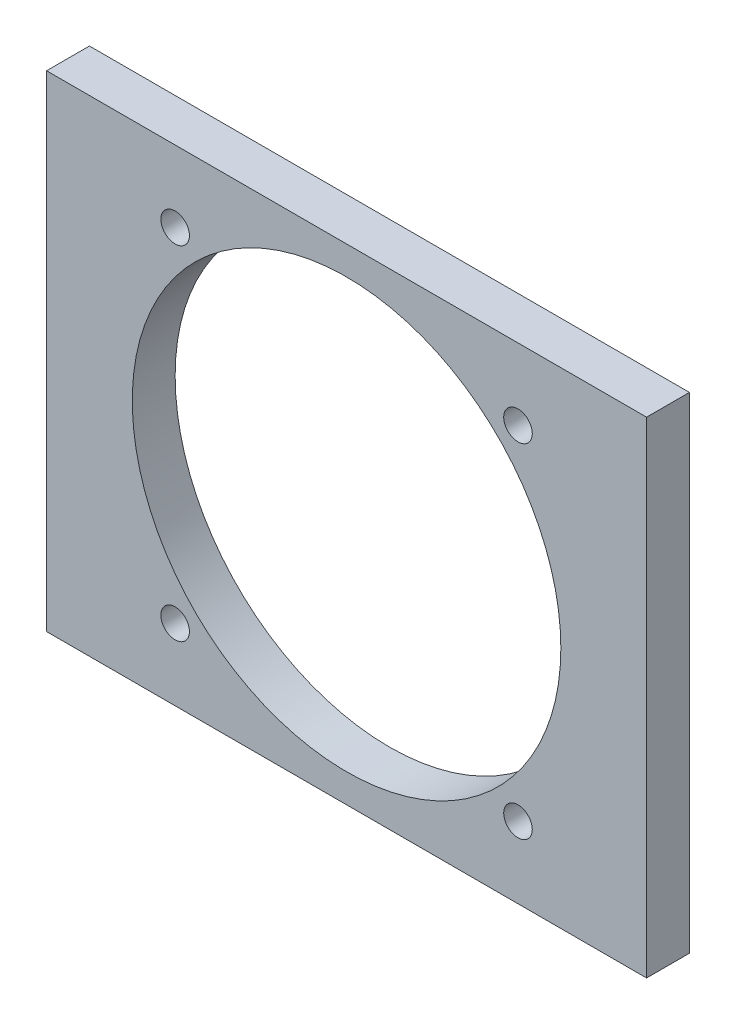
ISO-10303-21;
HEADER;
FILE_DESCRIPTION(('STEP AP214'),'2;1');
FILE_NAME('part.step','',(''),(''),'','','');
FILE_SCHEMA(('AUTOMOTIVE_DESIGN { 1 0 10303 214 1 1 1 1 }'));
ENDSEC;
DATA;
#1=APPLICATION_CONTEXT('core data for automotive mechanical design processes');
#2=APPLICATION_PROTOCOL_DEFINITION('international standard','automotive_design',2000,#1);
#3=PRODUCT_CONTEXT('',#1,'mechanical');
#4=PRODUCT('Part','Part','',(#3));
#5=PRODUCT_RELATED_PRODUCT_CATEGORY('part','',(#4));
#6=PRODUCT_DEFINITION_FORMATION('','',#4);
#7=PRODUCT_DEFINITION_CONTEXT('part definition',#1,'design');
#8=PRODUCT_DEFINITION('design','',#6,#7);
#9=PRODUCT_DEFINITION_SHAPE('','',#8);
#10=(LENGTH_UNIT() NAMED_UNIT(*) SI_UNIT(.MILLI.,.METRE.));
#11=(NAMED_UNIT(*) PLANE_ANGLE_UNIT() SI_UNIT($,.RADIAN.));
#12=(NAMED_UNIT(*) SI_UNIT($,.STERADIAN.) SOLID_ANGLE_UNIT());
#13=UNCERTAINTY_MEASURE_WITH_UNIT(LENGTH_MEASURE(1.E-05),#10,'distance_accuracy_value','');
#14=(GEOMETRIC_REPRESENTATION_CONTEXT(3) GLOBAL_UNCERTAINTY_ASSIGNED_CONTEXT((#13)) GLOBAL_UNIT_ASSIGNED_CONTEXT((#10,
#11,#12)) REPRESENTATION_CONTEXT('',''));
#15=CARTESIAN_POINT('',(0.,0.,0.));
#16=DIRECTION('',(0.,0.,1.));
#17=DIRECTION('',(1.,0.,0.));
#18=AXIS2_PLACEMENT_3D('',#15,#16,#17);
#19=CARTESIAN_POINT('',(105.,-85.,15.));
#20=DIRECTION('',(-1.,0.,0.));
#21=DIRECTION('',(0.,0.,1.));
#22=AXIS2_PLACEMENT_3D('',#19,#20,#21);
#23=PLANE('',#22);
#24=DIRECTION('',(0.,1.,0.));
#25=VECTOR('',#24,1.);
#26=CARTESIAN_POINT('',(105.,-85.,0.));
#27=LINE('',#26,#25);
#28=CARTESIAN_POINT('',(105.,-85.,0.));
#29=VERTEX_POINT('',#28);
#30=CARTESIAN_POINT('',(105.,85.,0.));
#31=VERTEX_POINT('',#30);
#32=EDGE_CURVE('E102',#29,#31,#27,.T.);
#33=ORIENTED_EDGE('',*,*,#32,.T.);
#34=DIRECTION('',(0.,0.,-1.));
#35=VECTOR('',#34,1.);
#36=CARTESIAN_POINT('',(105.,85.,15.));
#37=LINE('',#36,#35);
#38=CARTESIAN_POINT('',(105.,85.,15.));
#39=VERTEX_POINT('',#38);
#40=EDGE_CURVE('E11',#39,#31,#37,.T.);
#41=ORIENTED_EDGE('',*,*,#40,.F.);
#42=DIRECTION('',(0.,1.,0.));
#43=VECTOR('',#42,1.);
#44=CARTESIAN_POINT('',(105.,-85.,15.));
#45=LINE('',#44,#43);
#46=CARTESIAN_POINT('',(105.,-85.,15.));
#47=VERTEX_POINT('',#46);
#48=EDGE_CURVE('E90',#47,#39,#45,.T.);
#49=ORIENTED_EDGE('',*,*,#48,.F.);
#50=DIRECTION('',(0.,0.,-1.));
#51=VECTOR('',#50,1.);
#52=CARTESIAN_POINT('',(105.,-85.,15.));
#53=LINE('',#52,#51);
#54=EDGE_CURVE('E98',#47,#29,#53,.T.);
#55=ORIENTED_EDGE('',*,*,#54,.T.);
#56=EDGE_LOOP('',(#33,#41,#49,#55));
#57=FACE_BOUND('',#56,.T.);
#58=ADVANCED_FACE('F39',(#57),#23,.F.);
#59=CARTESIAN_POINT('',(-105.,85.,15.));
#60=DIRECTION('',(0.,-1.,0.));
#61=DIRECTION('',(0.,0.,-1.));
#62=AXIS2_PLACEMENT_3D('',#59,#60,#61);
#63=PLANE('',#62);
#64=DIRECTION('',(-1.,0.,0.));
#65=VECTOR('',#64,1.);
#66=CARTESIAN_POINT('',(-105.,85.,0.));
#67=LINE('',#66,#65);
#68=CARTESIAN_POINT('',(-105.,85.,0.));
#69=VERTEX_POINT('',#68);
#70=EDGE_CURVE('E94',#31,#69,#67,.T.);
#71=ORIENTED_EDGE('',*,*,#70,.T.);
#72=DIRECTION('',(0.,0.,-1.));
#73=VECTOR('',#72,1.);
#74=CARTESIAN_POINT('',(-105.,85.,15.));
#75=LINE('',#74,#73);
#76=CARTESIAN_POINT('',(-105.,85.,15.));
#77=VERTEX_POINT('',#76);
#78=EDGE_CURVE('E47',#77,#69,#75,.T.);
#79=ORIENTED_EDGE('',*,*,#78,.F.);
#80=DIRECTION('',(-1.,0.,0.));
#81=VECTOR('',#80,1.);
#82=CARTESIAN_POINT('',(-105.,85.,15.));
#83=LINE('',#82,#81);
#84=EDGE_CURVE('E85',#39,#77,#83,.T.);
#85=ORIENTED_EDGE('',*,*,#84,.F.);
#86=ORIENTED_EDGE('',*,*,#40,.T.);
#87=EDGE_LOOP('',(#71,#79,#85,#86));
#88=FACE_BOUND('',#87,.T.);
#89=ADVANCED_FACE('F93',(#88),#63,.F.);
#90=CARTESIAN_POINT('',(-105.,-85.,15.));
#91=DIRECTION('',(1.,0.,0.));
#92=DIRECTION('',(0.,0.,-1.));
#93=AXIS2_PLACEMENT_3D('',#90,#91,#92);
#94=PLANE('',#93);
#95=DIRECTION('',(0.,-1.,0.));
#96=VECTOR('',#95,1.);
#97=CARTESIAN_POINT('',(-105.,-85.,0.));
#98=LINE('',#97,#96);
#99=CARTESIAN_POINT('',(-105.,-85.,0.));
#100=VERTEX_POINT('',#99);
#101=EDGE_CURVE('E72',#69,#100,#98,.T.);
#102=ORIENTED_EDGE('',*,*,#101,.T.);
#103=DIRECTION('',(0.,0.,-1.));
#104=VECTOR('',#103,1.);
#105=CARTESIAN_POINT('',(-105.,-85.,15.));
#106=LINE('',#105,#104);
#107=CARTESIAN_POINT('',(-105.,-85.,15.));
#108=VERTEX_POINT('',#107);
#109=EDGE_CURVE('E95',#108,#100,#106,.T.);
#110=ORIENTED_EDGE('',*,*,#109,.F.);
#111=DIRECTION('',(0.,-1.,0.));
#112=VECTOR('',#111,1.);
#113=CARTESIAN_POINT('',(-105.,-85.,15.));
#114=LINE('',#113,#112);
#115=EDGE_CURVE('E88',#77,#108,#114,.T.);
#116=ORIENTED_EDGE('',*,*,#115,.F.);
#117=ORIENTED_EDGE('',*,*,#78,.T.);
#118=EDGE_LOOP('',(#102,#110,#116,#117));
#119=FACE_BOUND('',#118,.T.);
#120=ADVANCED_FACE('F96',(#119),#94,.F.);
#121=CARTESIAN_POINT('',(-105.,-85.,15.));
#122=DIRECTION('',(0.,1.,0.));
#123=DIRECTION('',(0.,0.,1.));
#124=AXIS2_PLACEMENT_3D('',#121,#122,#123);
#125=PLANE('',#124);
#126=DIRECTION('',(1.,0.,0.));
#127=VECTOR('',#126,1.);
#128=CARTESIAN_POINT('',(-105.,-85.,0.));
#129=LINE('',#128,#127);
#130=EDGE_CURVE('E78',#100,#29,#129,.T.);
#131=ORIENTED_EDGE('',*,*,#130,.T.);
#132=ORIENTED_EDGE('',*,*,#54,.F.);
#133=DIRECTION('',(1.,0.,0.));
#134=VECTOR('',#133,1.);
#135=CARTESIAN_POINT('',(-105.,-85.,15.));
#136=LINE('',#135,#134);
#137=EDGE_CURVE('E55',#108,#47,#136,.T.);
#138=ORIENTED_EDGE('',*,*,#137,.F.);
#139=ORIENTED_EDGE('',*,*,#109,.T.);
#140=EDGE_LOOP('',(#131,#132,#138,#139));
#141=FACE_BOUND('',#140,.T.);
#142=ADVANCED_FACE('F110',(#141),#125,.F.);
#143=CARTESIAN_POINT('',(0.,0.,15.));
#144=DIRECTION('',(0.,0.,-1.));
#145=DIRECTION('',(-1.,0.,0.));
#146=AXIS2_PLACEMENT_3D('',#143,#144,#145);
#147=PLANE('',#146);
#148=CARTESIAN_POINT('',(-60.,-60.,15.));
#149=DIRECTION('',(0.,0.,1.));
#150=DIRECTION('',(1.,0.,0.));
#151=AXIS2_PLACEMENT_3D('',#148,#149,#150);
#152=CIRCLE('',#151,5.);
#153=CARTESIAN_POINT('',(-55.,-60.,15.));
#154=VERTEX_POINT('',#153);
#155=EDGE_CURVE('E122',#154,#154,#152,.T.);
#156=ORIENTED_EDGE('',*,*,#155,.F.);
#157=EDGE_LOOP('',(#156));
#158=FACE_BOUND('',#157,.T.);
#159=CARTESIAN_POINT('',(60.,-60.,15.));
#160=DIRECTION('',(0.,0.,1.));
#161=DIRECTION('',(1.,0.,0.));
#162=AXIS2_PLACEMENT_3D('',#159,#160,#161);
#163=CIRCLE('',#162,5.);
#164=CARTESIAN_POINT('',(65.,-60.,15.));
#165=VERTEX_POINT('',#164);
#166=EDGE_CURVE('E129',#165,#165,#163,.T.);
#167=ORIENTED_EDGE('',*,*,#166,.F.);
#168=EDGE_LOOP('',(#167));
#169=FACE_BOUND('',#168,.T.);
#170=CARTESIAN_POINT('',(60.,60.,15.));
#171=DIRECTION('',(0.,0.,1.));
#172=DIRECTION('',(1.,0.,0.));
#173=AXIS2_PLACEMENT_3D('',#170,#171,#172);
#174=CIRCLE('',#173,5.);
#175=CARTESIAN_POINT('',(65.,60.,15.));
#176=VERTEX_POINT('',#175);
#177=EDGE_CURVE('E135',#176,#176,#174,.T.);
#178=ORIENTED_EDGE('',*,*,#177,.F.);
#179=EDGE_LOOP('',(#178));
#180=FACE_BOUND('',#179,.T.);
#181=CARTESIAN_POINT('',(-60.,60.,15.));
#182=DIRECTION('',(0.,0.,1.));
#183=DIRECTION('',(1.,0.,0.));
#184=AXIS2_PLACEMENT_3D('',#181,#182,#183);
#185=CIRCLE('',#184,5.);
#186=CARTESIAN_POINT('',(-55.,60.,15.));
#187=VERTEX_POINT('',#186);
#188=EDGE_CURVE('E121',#187,#187,#185,.T.);
#189=ORIENTED_EDGE('',*,*,#188,.F.);
#190=EDGE_LOOP('',(#189));
#191=FACE_BOUND('',#190,.T.);
#192=CARTESIAN_POINT('',(0.,0.,15.));
#193=DIRECTION('',(0.,0.,1.));
#194=DIRECTION('',(1.,0.,0.));
#195=AXIS2_PLACEMENT_3D('',#192,#193,#194);
#196=CIRCLE('',#195,75.);
#197=CARTESIAN_POINT('',(75.,0.,15.));
#198=VERTEX_POINT('',#197);
#199=EDGE_CURVE('E118',#198,#198,#196,.T.);
#200=ORIENTED_EDGE('',*,*,#199,.F.);
#201=EDGE_LOOP('',(#200));
#202=FACE_BOUND('',#201,.T.);
#203=ORIENTED_EDGE('',*,*,#48,.T.);
#204=ORIENTED_EDGE('',*,*,#84,.T.);
#205=ORIENTED_EDGE('',*,*,#115,.T.);
#206=ORIENTED_EDGE('',*,*,#137,.T.);
#207=EDGE_LOOP('',(#203,#204,#205,#206));
#208=FACE_BOUND('',#207,.T.);
#209=ADVANCED_FACE('F86',(#158,#169,#180,#191,#202,#208),#147,.F.);
#210=CARTESIAN_POINT('',(0.,0.,0.));
#211=DIRECTION('',(0.,0.,-1.));
#212=DIRECTION('',(-1.,0.,0.));
#213=AXIS2_PLACEMENT_3D('',#210,#211,#212);
#214=PLANE('',#213);
#215=CARTESIAN_POINT('',(-60.,-60.,0.));
#216=DIRECTION('',(0.,0.,-1.));
#217=DIRECTION('',(-1.,0.,0.));
#218=AXIS2_PLACEMENT_3D('',#215,#216,#217);
#219=CIRCLE('',#218,5.);
#220=CARTESIAN_POINT('',(-65.,-60.,0.));
#221=VERTEX_POINT('',#220);
#222=EDGE_CURVE('E126',#221,#221,#219,.F.);
#223=ORIENTED_EDGE('',*,*,#222,.T.);
#224=EDGE_LOOP('',(#223));
#225=FACE_BOUND('',#224,.T.);
#226=CARTESIAN_POINT('',(60.,-60.,0.));
#227=DIRECTION('',(0.,0.,-1.));
#228=DIRECTION('',(-1.,0.,0.));
#229=AXIS2_PLACEMENT_3D('',#226,#227,#228);
#230=CIRCLE('',#229,5.);
#231=CARTESIAN_POINT('',(55.,-60.,0.));
#232=VERTEX_POINT('',#231);
#233=EDGE_CURVE('E125',#232,#232,#230,.F.);
#234=ORIENTED_EDGE('',*,*,#233,.T.);
#235=EDGE_LOOP('',(#234));
#236=FACE_BOUND('',#235,.T.);
#237=CARTESIAN_POINT('',(60.,60.,0.));
#238=DIRECTION('',(0.,0.,-1.));
#239=DIRECTION('',(-1.,0.,0.));
#240=AXIS2_PLACEMENT_3D('',#237,#238,#239);
#241=CIRCLE('',#240,5.);
#242=CARTESIAN_POINT('',(55.,60.,0.));
#243=VERTEX_POINT('',#242);
#244=EDGE_CURVE('E132',#243,#243,#241,.F.);
#245=ORIENTED_EDGE('',*,*,#244,.T.);
#246=EDGE_LOOP('',(#245));
#247=FACE_BOUND('',#246,.T.);
#248=CARTESIAN_POINT('',(-60.,60.,0.));
#249=DIRECTION('',(0.,0.,-1.));
#250=DIRECTION('',(-1.,0.,0.));
#251=AXIS2_PLACEMENT_3D('',#248,#249,#250);
#252=CIRCLE('',#251,5.);
#253=CARTESIAN_POINT('',(-65.,60.,0.));
#254=VERTEX_POINT('',#253);
#255=EDGE_CURVE('E138',#254,#254,#252,.F.);
#256=ORIENTED_EDGE('',*,*,#255,.T.);
#257=EDGE_LOOP('',(#256));
#258=FACE_BOUND('',#257,.T.);
#259=CARTESIAN_POINT('',(0.,0.,0.));
#260=DIRECTION('',(0.,0.,-1.));
#261=DIRECTION('',(-1.,0.,0.));
#262=AXIS2_PLACEMENT_3D('',#259,#260,#261);
#263=CIRCLE('',#262,75.);
#264=CARTESIAN_POINT('',(-75.,0.,0.));
#265=VERTEX_POINT('',#264);
#266=EDGE_CURVE('E105',#265,#265,#263,.F.);
#267=ORIENTED_EDGE('',*,*,#266,.T.);
#268=EDGE_LOOP('',(#267));
#269=FACE_BOUND('',#268,.T.);
#270=ORIENTED_EDGE('',*,*,#32,.F.);
#271=ORIENTED_EDGE('',*,*,#130,.F.);
#272=ORIENTED_EDGE('',*,*,#101,.F.);
#273=ORIENTED_EDGE('',*,*,#70,.F.);
#274=EDGE_LOOP('',(#270,#271,#272,#273));
#275=FACE_BOUND('',#274,.T.);
#276=ADVANCED_FACE('F113',(#225,#236,#247,#258,#269,#275),#214,.T.);
#277=CARTESIAN_POINT('',(0.,0.,-212.132034355964));
#278=DIRECTION('',(0.,0.,1.));
#279=DIRECTION('',(1.,0.,0.));
#280=AXIS2_PLACEMENT_3D('',#277,#278,#279);
#281=CYLINDRICAL_SURFACE('',#280,75.);
#282=ORIENTED_EDGE('',*,*,#199,.T.);
#283=EDGE_LOOP('',(#282));
#284=FACE_BOUND('',#283,.T.);
#285=ORIENTED_EDGE('',*,*,#266,.F.);
#286=EDGE_LOOP('',(#285));
#287=FACE_BOUND('',#286,.T.);
#288=ADVANCED_FACE('F151',(#284,#287),#281,.F.);
#289=CARTESIAN_POINT('',(-60.,60.,-212.132034355964));
#290=DIRECTION('',(0.,0.,1.));
#291=DIRECTION('',(1.,0.,0.));
#292=AXIS2_PLACEMENT_3D('',#289,#290,#291);
#293=CYLINDRICAL_SURFACE('',#292,5.);
#294=ORIENTED_EDGE('',*,*,#188,.T.);
#295=EDGE_LOOP('',(#294));
#296=FACE_BOUND('',#295,.T.);
#297=ORIENTED_EDGE('',*,*,#255,.F.);
#298=EDGE_LOOP('',(#297));
#299=FACE_BOUND('',#298,.T.);
#300=ADVANCED_FACE('F148',(#296,#299),#293,.F.);
#301=CARTESIAN_POINT('',(60.,60.,-212.132034355964));
#302=DIRECTION('',(0.,0.,1.));
#303=DIRECTION('',(1.,0.,0.));
#304=AXIS2_PLACEMENT_3D('',#301,#302,#303);
#305=CYLINDRICAL_SURFACE('',#304,5.);
#306=ORIENTED_EDGE('',*,*,#177,.T.);
#307=EDGE_LOOP('',(#306));
#308=FACE_BOUND('',#307,.T.);
#309=ORIENTED_EDGE('',*,*,#244,.F.);
#310=EDGE_LOOP('',(#309));
#311=FACE_BOUND('',#310,.T.);
#312=ADVANCED_FACE('F150',(#308,#311),#305,.F.);
#313=CARTESIAN_POINT('',(60.,-60.,-212.132034355964));
#314=DIRECTION('',(0.,0.,1.));
#315=DIRECTION('',(1.,0.,0.));
#316=AXIS2_PLACEMENT_3D('',#313,#314,#315);
#317=CYLINDRICAL_SURFACE('',#316,5.);
#318=ORIENTED_EDGE('',*,*,#166,.T.);
#319=EDGE_LOOP('',(#318));
#320=FACE_BOUND('',#319,.T.);
#321=ORIENTED_EDGE('',*,*,#233,.F.);
#322=EDGE_LOOP('',(#321));
#323=FACE_BOUND('',#322,.T.);
#324=ADVANCED_FACE('F158',(#320,#323),#317,.F.);
#325=CARTESIAN_POINT('',(-60.,-60.,-212.132034355964));
#326=DIRECTION('',(0.,0.,1.));
#327=DIRECTION('',(1.,0.,0.));
#328=AXIS2_PLACEMENT_3D('',#325,#326,#327);
#329=CYLINDRICAL_SURFACE('',#328,5.);
#330=ORIENTED_EDGE('',*,*,#155,.T.);
#331=EDGE_LOOP('',(#330));
#332=FACE_BOUND('',#331,.T.);
#333=ORIENTED_EDGE('',*,*,#222,.F.);
#334=EDGE_LOOP('',(#333));
#335=FACE_BOUND('',#334,.T.);
#336=ADVANCED_FACE('F180',(#332,#335),#329,.F.);
#337=CLOSED_SHELL('',(#58,#89,#120,#142,#209,#276,#288,#300,#312,#324,#336));
#338=MANIFOLD_SOLID_BREP('B2',#337);
#339=ADVANCED_BREP_SHAPE_REPRESENTATION('',(#18,#338),#14);
#340=SHAPE_DEFINITION_REPRESENTATION(#9,#339);
ENDSEC;
END-ISO-10303-21;
